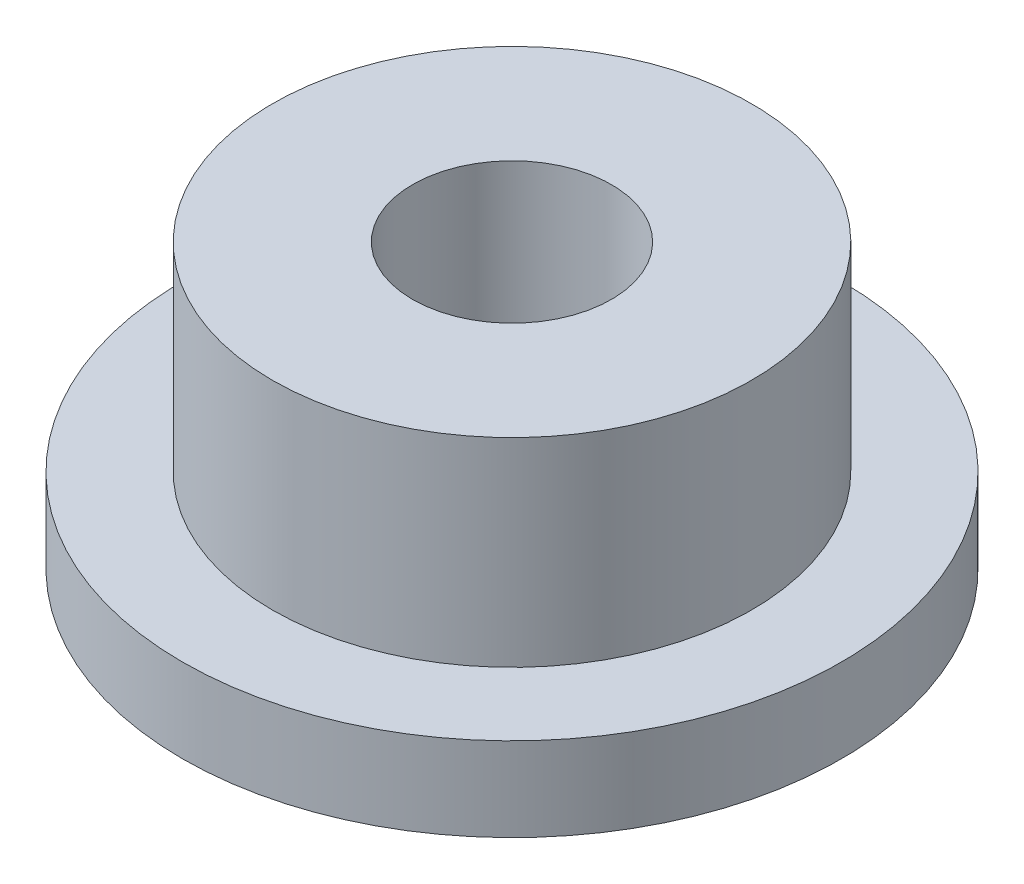
ISO-10303-21;
HEADER;
FILE_DESCRIPTION(('STEP AP214'),'2;1');
FILE_NAME('part.step','',(''),(''),'','','');
FILE_SCHEMA(('AUTOMOTIVE_DESIGN { 1 0 10303 214 1 1 1 1 }'));
ENDSEC;
DATA;
#1=APPLICATION_CONTEXT('core data for automotive mechanical design processes');
#2=APPLICATION_PROTOCOL_DEFINITION('international standard','automotive_design',2000,#1);
#3=PRODUCT_CONTEXT('',#1,'mechanical');
#4=PRODUCT('Part','Part','',(#3));
#5=PRODUCT_RELATED_PRODUCT_CATEGORY('part','',(#4));
#6=PRODUCT_DEFINITION_FORMATION('','',#4);
#7=PRODUCT_DEFINITION_CONTEXT('part definition',#1,'design');
#8=PRODUCT_DEFINITION('design','',#6,#7);
#9=PRODUCT_DEFINITION_SHAPE('','',#8);
#10=(LENGTH_UNIT() NAMED_UNIT(*) SI_UNIT(.MILLI.,.METRE.));
#11=(NAMED_UNIT(*) PLANE_ANGLE_UNIT() SI_UNIT($,.RADIAN.));
#12=(NAMED_UNIT(*) SI_UNIT($,.STERADIAN.) SOLID_ANGLE_UNIT());
#13=UNCERTAINTY_MEASURE_WITH_UNIT(LENGTH_MEASURE(1.E-05),#10,'distance_accuracy_value','');
#14=(GEOMETRIC_REPRESENTATION_CONTEXT(3) GLOBAL_UNCERTAINTY_ASSIGNED_CONTEXT((#13)) GLOBAL_UNIT_ASSIGNED_CONTEXT((#10,
#11,#12)) REPRESENTATION_CONTEXT('',''));
#15=CARTESIAN_POINT('',(0.,0.,0.));
#16=DIRECTION('',(0.,0.,1.));
#17=DIRECTION('',(1.,0.,0.));
#18=AXIS2_PLACEMENT_3D('',#15,#16,#17);
#19=CARTESIAN_POINT('',(0.,0.,0.));
#20=DIRECTION('',(0.,-1.,0.));
#21=DIRECTION('',(0.,0.,-1.));
#22=AXIS2_PLACEMENT_3D('',#19,#20,#21);
#23=CYLINDRICAL_SURFACE('',#22,6.35);
#24=CARTESIAN_POINT('',(0.,0.,0.));
#25=DIRECTION('',(0.,-1.,0.));
#26=DIRECTION('',(0.,0.,-1.));
#27=AXIS2_PLACEMENT_3D('',#24,#25,#26);
#28=CIRCLE('',#27,6.35);
#29=CARTESIAN_POINT('',(0.,0.,-6.35));
#30=VERTEX_POINT('',#29);
#31=EDGE_CURVE('E11',#30,#30,#28,.T.);
#32=ORIENTED_EDGE('',*,*,#31,.T.);
#33=EDGE_LOOP('',(#32));
#34=FACE_BOUND('',#33,.T.);
#35=CARTESIAN_POINT('',(0.,-6.35,0.));
#36=DIRECTION('',(0.,-1.,0.));
#37=DIRECTION('',(0.,0.,-1.));
#38=AXIS2_PLACEMENT_3D('',#35,#36,#37);
#39=CIRCLE('',#38,6.35);
#40=CARTESIAN_POINT('',(0.,-6.35,-6.35));
#41=VERTEX_POINT('',#40);
#42=EDGE_CURVE('E48',#41,#41,#39,.T.);
#43=ORIENTED_EDGE('',*,*,#42,.F.);
#44=EDGE_LOOP('',(#43));
#45=FACE_BOUND('',#44,.T.);
#46=ADVANCED_FACE('F42',(#34,#45),#23,.T.);
#47=CARTESIAN_POINT('',(6.35,0.,0.));
#48=DIRECTION('',(0.,1.,0.));
#49=DIRECTION('',(0.,0.,1.));
#50=AXIS2_PLACEMENT_3D('',#47,#48,#49);
#51=PLANE('',#50);
#52=ORIENTED_EDGE('',*,*,#31,.F.);
#53=EDGE_LOOP('',(#52));
#54=FACE_BOUND('',#53,.T.);
#55=ADVANCED_FACE('F57',(#54),#51,.T.);
#56=CARTESIAN_POINT('',(0.,-6.35,0.));
#57=DIRECTION('',(0.,-1.,0.));
#58=DIRECTION('',(0.,0.,-1.));
#59=AXIS2_PLACEMENT_3D('',#56,#57,#58);
#60=PLANE('',#59);
#61=ORIENTED_EDGE('',*,*,#42,.T.);
#62=EDGE_LOOP('',(#61));
#63=FACE_BOUND('',#62,.T.);
#64=ADVANCED_FACE('F54',(#63),#60,.T.);
#65=CLOSED_SHELL('',(#46,#55,#64));
#66=MANIFOLD_SOLID_BREP('B2',#65);
#67=CARTESIAN_POINT('',(0.,0.,0.));
#68=DIRECTION('',(0.,1.,0.));
#69=DIRECTION('',(0.,0.,1.));
#70=AXIS2_PLACEMENT_3D('',#67,#68,#69);
#71=CYLINDRICAL_SURFACE('',#70,21.034375);
#72=CARTESIAN_POINT('',(0.,1.,0.));
#73=DIRECTION('',(0.,1.,0.));
#74=DIRECTION('',(0.,0.,1.));
#75=AXIS2_PLACEMENT_3D('',#72,#73,#74);
#76=CIRCLE('',#75,21.034375);
#77=CARTESIAN_POINT('',(0.,1.,21.034375));
#78=VERTEX_POINT('',#77);
#79=EDGE_CURVE('E41',#78,#78,#76,.T.);
#80=ORIENTED_EDGE('',*,*,#79,.T.);
#81=EDGE_LOOP('',(#80));
#82=FACE_BOUND('',#81,.T.);
#83=CARTESIAN_POINT('',(0.,6.35,0.));
#84=DIRECTION('',(0.,1.,0.));
#85=DIRECTION('',(0.,0.,1.));
#86=AXIS2_PLACEMENT_3D('',#83,#84,#85);
#87=CIRCLE('',#86,21.034375);
#88=CARTESIAN_POINT('',(0.,6.35,21.034375));
#89=VERTEX_POINT('',#88);
#90=EDGE_CURVE('E110',#89,#89,#87,.T.);
#91=ORIENTED_EDGE('',*,*,#90,.F.);
#92=EDGE_LOOP('',(#91));
#93=FACE_BOUND('',#92,.T.);
#94=ADVANCED_FACE('F82',(#82,#93),#71,.T.);
#95=CARTESIAN_POINT('',(21.034375,1.,0.));
#96=DIRECTION('',(0.,-1.,0.));
#97=DIRECTION('',(0.,0.,-1.));
#98=AXIS2_PLACEMENT_3D('',#95,#96,#97);
#99=PLANE('',#98);
#100=CARTESIAN_POINT('',(0.,1.,0.));
#101=DIRECTION('',(0.,1.,0.));
#102=DIRECTION('',(0.,0.,1.));
#103=AXIS2_PLACEMENT_3D('',#100,#101,#102);
#104=CIRCLE('',#103,8.5);
#105=CARTESIAN_POINT('',(0.,1.,8.5));
#106=VERTEX_POINT('',#105);
#107=EDGE_CURVE('E88',#106,#106,#104,.T.);
#108=ORIENTED_EDGE('',*,*,#107,.T.);
#109=EDGE_LOOP('',(#108));
#110=FACE_BOUND('',#109,.T.);
#111=ORIENTED_EDGE('',*,*,#79,.F.);
#112=EDGE_LOOP('',(#111));
#113=FACE_BOUND('',#112,.T.);
#114=ADVANCED_FACE('F118',(#110,#113),#99,.T.);
#115=CARTESIAN_POINT('',(0.,0.,0.));
#116=DIRECTION('',(0.,1.,0.));
#117=DIRECTION('',(0.,0.,1.));
#118=AXIS2_PLACEMENT_3D('',#115,#116,#117);
#119=CYLINDRICAL_SURFACE('',#118,8.5);
#120=CARTESIAN_POINT('',(0.,0.,0.));
#121=DIRECTION('',(0.,1.,0.));
#122=DIRECTION('',(0.,0.,1.));
#123=AXIS2_PLACEMENT_3D('',#120,#121,#122);
#124=CIRCLE('',#123,8.5);
#125=CARTESIAN_POINT('',(0.,0.,8.5));
#126=VERTEX_POINT('',#125);
#127=EDGE_CURVE('E92',#126,#126,#124,.T.);
#128=ORIENTED_EDGE('',*,*,#127,.T.);
#129=EDGE_LOOP('',(#128));
#130=FACE_BOUND('',#129,.T.);
#131=ORIENTED_EDGE('',*,*,#107,.F.);
#132=EDGE_LOOP('',(#131));
#133=FACE_BOUND('',#132,.T.);
#134=ADVANCED_FACE('F122',(#130,#133),#119,.T.);
#135=CARTESIAN_POINT('',(8.5,0.,0.));
#136=DIRECTION('',(0.,-1.,0.));
#137=DIRECTION('',(0.,0.,-1.));
#138=AXIS2_PLACEMENT_3D('',#135,#136,#137);
#139=PLANE('',#138);
#140=CARTESIAN_POINT('',(0.,0.,0.));
#141=DIRECTION('',(0.,1.,0.));
#142=DIRECTION('',(0.,0.,1.));
#143=AXIS2_PLACEMENT_3D('',#140,#141,#142);
#144=CIRCLE('',#143,6.35);
#145=CARTESIAN_POINT('',(0.,0.,6.35));
#146=VERTEX_POINT('',#145);
#147=EDGE_CURVE('E96',#146,#146,#144,.T.);
#148=ORIENTED_EDGE('',*,*,#147,.T.);
#149=EDGE_LOOP('',(#148));
#150=FACE_BOUND('',#149,.T.);
#151=ORIENTED_EDGE('',*,*,#127,.F.);
#152=EDGE_LOOP('',(#151));
#153=FACE_BOUND('',#152,.T.);
#154=ADVANCED_FACE('F126',(#150,#153),#139,.T.);
#155=CARTESIAN_POINT('',(0.,0.,0.));
#156=DIRECTION('',(0.,1.,0.));
#157=DIRECTION('',(0.,0.,1.));
#158=AXIS2_PLACEMENT_3D('',#155,#156,#157);
#159=CYLINDRICAL_SURFACE('',#158,6.35);
#160=CARTESIAN_POINT('',(0.,19.05,0.));
#161=DIRECTION('',(0.,1.,0.));
#162=DIRECTION('',(0.,0.,1.));
#163=AXIS2_PLACEMENT_3D('',#160,#161,#162);
#164=CIRCLE('',#163,6.35);
#165=CARTESIAN_POINT('',(0.,19.05,6.35));
#166=VERTEX_POINT('',#165);
#167=EDGE_CURVE('E101',#166,#166,#164,.T.);
#168=ORIENTED_EDGE('',*,*,#167,.T.);
#169=EDGE_LOOP('',(#168));
#170=FACE_BOUND('',#169,.T.);
#171=ORIENTED_EDGE('',*,*,#147,.F.);
#172=EDGE_LOOP('',(#171));
#173=FACE_BOUND('',#172,.T.);
#174=ADVANCED_FACE('F133',(#170,#173),#159,.F.);
#175=CARTESIAN_POINT('',(6.35,19.05,0.));
#176=DIRECTION('',(0.,1.,0.));
#177=DIRECTION('',(0.,0.,1.));
#178=AXIS2_PLACEMENT_3D('',#175,#176,#177);
#179=PLANE('',#178);
#180=CARTESIAN_POINT('',(0.,19.05,0.));
#181=DIRECTION('',(0.,1.,0.));
#182=DIRECTION('',(0.,0.,1.));
#183=AXIS2_PLACEMENT_3D('',#180,#181,#182);
#184=CIRCLE('',#183,15.2908);
#185=CARTESIAN_POINT('',(0.,19.05,15.2908));
#186=VERTEX_POINT('',#185);
#187=EDGE_CURVE('E104',#186,#186,#184,.T.);
#188=ORIENTED_EDGE('',*,*,#187,.T.);
#189=EDGE_LOOP('',(#188));
#190=FACE_BOUND('',#189,.T.);
#191=ORIENTED_EDGE('',*,*,#167,.F.);
#192=EDGE_LOOP('',(#191));
#193=FACE_BOUND('',#192,.T.);
#194=ADVANCED_FACE('F137',(#190,#193),#179,.T.);
#195=CARTESIAN_POINT('',(0.,0.,0.));
#196=DIRECTION('',(0.,1.,0.));
#197=DIRECTION('',(0.,0.,1.));
#198=AXIS2_PLACEMENT_3D('',#195,#196,#197);
#199=CYLINDRICAL_SURFACE('',#198,15.2908);
#200=CARTESIAN_POINT('',(0.,6.35,0.));
#201=DIRECTION('',(0.,1.,0.));
#202=DIRECTION('',(0.,0.,1.));
#203=AXIS2_PLACEMENT_3D('',#200,#201,#202);
#204=CIRCLE('',#203,15.2908);
#205=CARTESIAN_POINT('',(0.,6.35,15.2908));
#206=VERTEX_POINT('',#205);
#207=EDGE_CURVE('E107',#206,#206,#204,.T.);
#208=ORIENTED_EDGE('',*,*,#207,.T.);
#209=EDGE_LOOP('',(#208));
#210=FACE_BOUND('',#209,.T.);
#211=ORIENTED_EDGE('',*,*,#187,.F.);
#212=EDGE_LOOP('',(#211));
#213=FACE_BOUND('',#212,.T.);
#214=ADVANCED_FACE('F141',(#210,#213),#199,.T.);
#215=CARTESIAN_POINT('',(15.2908,6.35,0.));
#216=DIRECTION('',(0.,1.,0.));
#217=DIRECTION('',(0.,0.,1.));
#218=AXIS2_PLACEMENT_3D('',#215,#216,#217);
#219=PLANE('',#218);
#220=ORIENTED_EDGE('',*,*,#90,.T.);
#221=EDGE_LOOP('',(#220));
#222=FACE_BOUND('',#221,.T.);
#223=ORIENTED_EDGE('',*,*,#207,.F.);
#224=EDGE_LOOP('',(#223));
#225=FACE_BOUND('',#224,.T.);
#226=ADVANCED_FACE('F114',(#222,#225),#219,.T.);
#227=CLOSED_SHELL('',(#94,#114,#134,#154,#174,#194,#214,#226));
#228=MANIFOLD_SOLID_BREP('B6',#227);
#229=ADVANCED_BREP_SHAPE_REPRESENTATION('',(#18,#66,#228),#14);
#230=SHAPE_DEFINITION_REPRESENTATION(#9,#229);
ENDSEC;
END-ISO-10303-21;
